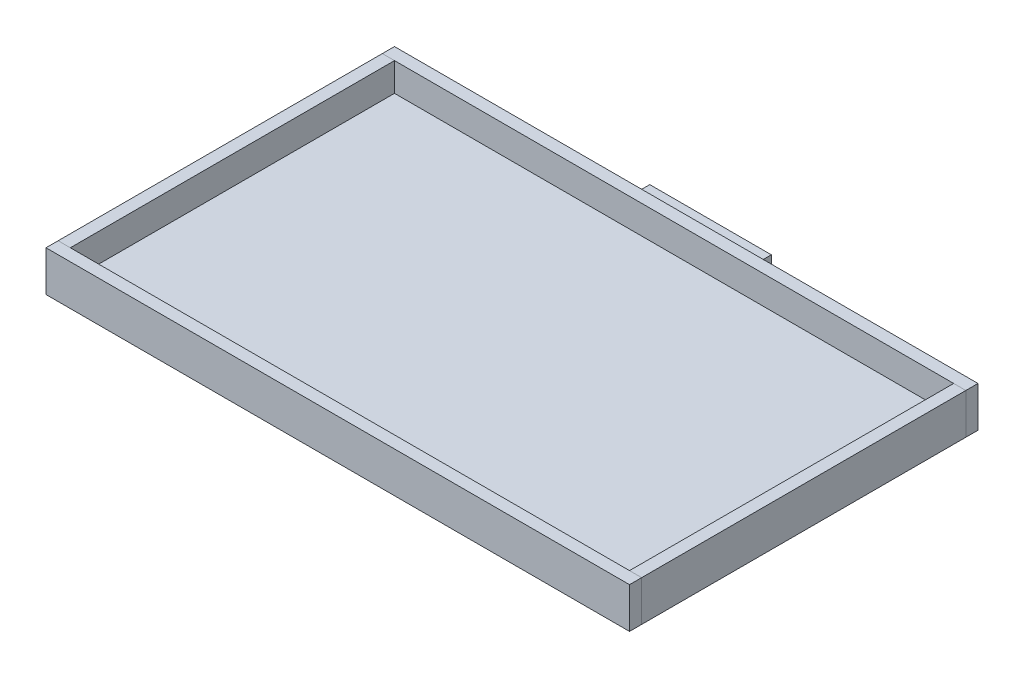
ISO-10303-21;
HEADER;
FILE_DESCRIPTION(('STEP AP214'),'2;1');
FILE_NAME('part.step','',(''),(''),'','','');
FILE_SCHEMA(('AUTOMOTIVE_DESIGN { 1 0 10303 214 1 1 1 1 }'));
ENDSEC;
DATA;
#1=APPLICATION_CONTEXT('core data for automotive mechanical design processes');
#2=APPLICATION_PROTOCOL_DEFINITION('international standard','automotive_design',2000,#1);
#3=PRODUCT_CONTEXT('',#1,'mechanical');
#4=PRODUCT('Part','Part','',(#3));
#5=PRODUCT_RELATED_PRODUCT_CATEGORY('part','',(#4));
#6=PRODUCT_DEFINITION_FORMATION('','',#4);
#7=PRODUCT_DEFINITION_CONTEXT('part definition',#1,'design');
#8=PRODUCT_DEFINITION('design','',#6,#7);
#9=PRODUCT_DEFINITION_SHAPE('','',#8);
#10=(LENGTH_UNIT() NAMED_UNIT(*) SI_UNIT(.MILLI.,.METRE.));
#11=(NAMED_UNIT(*) PLANE_ANGLE_UNIT() SI_UNIT($,.RADIAN.));
#12=(NAMED_UNIT(*) SI_UNIT($,.STERADIAN.) SOLID_ANGLE_UNIT());
#13=UNCERTAINTY_MEASURE_WITH_UNIT(LENGTH_MEASURE(1.E-05),#10,'distance_accuracy_value','');
#14=(GEOMETRIC_REPRESENTATION_CONTEXT(3) GLOBAL_UNCERTAINTY_ASSIGNED_CONTEXT((#13)) GLOBAL_UNIT_ASSIGNED_CONTEXT((#10,
#11,#12)) REPRESENTATION_CONTEXT('',''));
#15=CARTESIAN_POINT('',(0.,0.,0.));
#16=DIRECTION('',(0.,0.,1.));
#17=DIRECTION('',(1.,0.,0.));
#18=AXIS2_PLACEMENT_3D('',#15,#16,#17);
#19=CARTESIAN_POINT('',(895.35,0.,0.));
#20=DIRECTION('',(0.,0.,-1.));
#21=DIRECTION('',(-1.,0.,0.));
#22=AXIS2_PLACEMENT_3D('',#19,#20,#21);
#23=PLANE('',#22);
#24=DIRECTION('',(0.,-1.,0.));
#25=VECTOR('',#24,1.);
#26=CARTESIAN_POINT('',(876.3,0.,0.));
#27=LINE('',#26,#25);
#28=CARTESIAN_POINT('',(876.3,63.5,0.));
#29=VERTEX_POINT('',#28);
#30=CARTESIAN_POINT('',(876.3,0.,0.));
#31=VERTEX_POINT('',#30);
#32=EDGE_CURVE('E107',#29,#31,#27,.T.);
#33=ORIENTED_EDGE('',*,*,#32,.T.);
#34=DIRECTION('',(-1.,0.,0.));
#35=VECTOR('',#34,1.);
#36=CARTESIAN_POINT('',(895.35,0.,0.));
#37=LINE('',#36,#35);
#38=CARTESIAN_POINT('',(895.35,0.,0.));
#39=VERTEX_POINT('',#38);
#40=EDGE_CURVE('E12',#39,#31,#37,.T.);
#41=ORIENTED_EDGE('',*,*,#40,.F.);
#42=DIRECTION('',(0.,-1.,0.));
#43=VECTOR('',#42,1.);
#44=CARTESIAN_POINT('',(895.35,0.,0.));
#45=LINE('',#44,#43);
#46=CARTESIAN_POINT('',(895.35,63.5,0.));
#47=VERTEX_POINT('',#46);
#48=EDGE_CURVE('E95',#47,#39,#45,.T.);
#49=ORIENTED_EDGE('',*,*,#48,.F.);
#50=DIRECTION('',(-1.,0.,0.));
#51=VECTOR('',#50,1.);
#52=CARTESIAN_POINT('',(895.35,63.5,0.));
#53=LINE('',#52,#51);
#54=EDGE_CURVE('E103',#47,#29,#53,.T.);
#55=ORIENTED_EDGE('',*,*,#54,.T.);
#56=EDGE_LOOP('',(#33,#41,#49,#55));
#57=FACE_BOUND('',#56,.T.);
#58=ADVANCED_FACE('F44',(#57),#23,.F.);
#59=CARTESIAN_POINT('',(895.35,0.,0.));
#60=DIRECTION('',(0.,1.,0.));
#61=DIRECTION('',(0.,0.,1.));
#62=AXIS2_PLACEMENT_3D('',#59,#60,#61);
#63=PLANE('',#62);
#64=DIRECTION('',(0.,0.,-1.));
#65=VECTOR('',#64,1.);
#66=CARTESIAN_POINT('',(876.3,0.,0.));
#67=LINE('',#66,#65);
#68=CARTESIAN_POINT('',(876.3,0.,-508.));
#69=VERTEX_POINT('',#68);
#70=EDGE_CURVE('E99',#31,#69,#67,.T.);
#71=ORIENTED_EDGE('',*,*,#70,.T.);
#72=DIRECTION('',(-1.,0.,0.));
#73=VECTOR('',#72,1.);
#74=CARTESIAN_POINT('',(895.35,0.,-508.));
#75=LINE('',#74,#73);
#76=CARTESIAN_POINT('',(895.35,0.,-508.));
#77=VERTEX_POINT('',#76);
#78=EDGE_CURVE('E52',#77,#69,#75,.T.);
#79=ORIENTED_EDGE('',*,*,#78,.F.);
#80=DIRECTION('',(0.,0.,-1.));
#81=VECTOR('',#80,1.);
#82=CARTESIAN_POINT('',(895.35,0.,0.));
#83=LINE('',#82,#81);
#84=EDGE_CURVE('E90',#39,#77,#83,.T.);
#85=ORIENTED_EDGE('',*,*,#84,.F.);
#86=ORIENTED_EDGE('',*,*,#40,.T.);
#87=EDGE_LOOP('',(#71,#79,#85,#86));
#88=FACE_BOUND('',#87,.T.);
#89=ADVANCED_FACE('F98',(#88),#63,.F.);
#90=CARTESIAN_POINT('',(895.35,0.,-508.));
#91=DIRECTION('',(0.,0.,1.));
#92=DIRECTION('',(1.,0.,0.));
#93=AXIS2_PLACEMENT_3D('',#90,#91,#92);
#94=PLANE('',#93);
#95=DIRECTION('',(0.,1.,0.));
#96=VECTOR('',#95,1.);
#97=CARTESIAN_POINT('',(876.3,0.,-508.));
#98=LINE('',#97,#96);
#99=CARTESIAN_POINT('',(876.3,63.5,-508.));
#100=VERTEX_POINT('',#99);
#101=EDGE_CURVE('E77',#69,#100,#98,.T.);
#102=ORIENTED_EDGE('',*,*,#101,.T.);
#103=DIRECTION('',(-1.,0.,0.));
#104=VECTOR('',#103,1.);
#105=CARTESIAN_POINT('',(895.35,63.5,-508.));
#106=LINE('',#105,#104);
#107=CARTESIAN_POINT('',(895.35,63.5,-508.));
#108=VERTEX_POINT('',#107);
#109=EDGE_CURVE('E100',#108,#100,#106,.T.);
#110=ORIENTED_EDGE('',*,*,#109,.F.);
#111=DIRECTION('',(0.,1.,0.));
#112=VECTOR('',#111,1.);
#113=CARTESIAN_POINT('',(895.35,0.,-508.));
#114=LINE('',#113,#112);
#115=EDGE_CURVE('E93',#77,#108,#114,.T.);
#116=ORIENTED_EDGE('',*,*,#115,.F.);
#117=ORIENTED_EDGE('',*,*,#78,.T.);
#118=EDGE_LOOP('',(#102,#110,#116,#117));
#119=FACE_BOUND('',#118,.T.);
#120=ADVANCED_FACE('F101',(#119),#94,.F.);
#121=CARTESIAN_POINT('',(895.35,63.5,0.));
#122=DIRECTION('',(0.,-1.,0.));
#123=DIRECTION('',(0.,0.,-1.));
#124=AXIS2_PLACEMENT_3D('',#121,#122,#123);
#125=PLANE('',#124);
#126=DIRECTION('',(0.,0.,1.));
#127=VECTOR('',#126,1.);
#128=CARTESIAN_POINT('',(876.3,63.5,0.));
#129=LINE('',#128,#127);
#130=EDGE_CURVE('E83',#100,#29,#129,.T.);
#131=ORIENTED_EDGE('',*,*,#130,.T.);
#132=ORIENTED_EDGE('',*,*,#54,.F.);
#133=DIRECTION('',(0.,0.,1.));
#134=VECTOR('',#133,1.);
#135=CARTESIAN_POINT('',(895.35,63.5,0.));
#136=LINE('',#135,#134);
#137=EDGE_CURVE('E60',#108,#47,#136,.T.);
#138=ORIENTED_EDGE('',*,*,#137,.F.);
#139=ORIENTED_EDGE('',*,*,#109,.T.);
#140=EDGE_LOOP('',(#131,#132,#138,#139));
#141=FACE_BOUND('',#140,.T.);
#142=ADVANCED_FACE('F114',(#141),#125,.F.);
#143=CARTESIAN_POINT('',(895.35,0.,0.));
#144=DIRECTION('',(-1.,0.,0.));
#145=DIRECTION('',(0.,0.,1.));
#146=AXIS2_PLACEMENT_3D('',#143,#144,#145);
#147=PLANE('',#146);
#148=ORIENTED_EDGE('',*,*,#48,.T.);
#149=ORIENTED_EDGE('',*,*,#84,.T.);
#150=ORIENTED_EDGE('',*,*,#115,.T.);
#151=ORIENTED_EDGE('',*,*,#137,.T.);
#152=EDGE_LOOP('',(#148,#149,#150,#151));
#153=FACE_BOUND('',#152,.T.);
#154=ADVANCED_FACE('F91',(#153),#147,.F.);
#155=CARTESIAN_POINT('',(876.3,0.,0.));
#156=DIRECTION('',(-1.,0.,0.));
#157=DIRECTION('',(0.,0.,1.));
#158=AXIS2_PLACEMENT_3D('',#155,#156,#157);
#159=PLANE('',#158);
#160=ORIENTED_EDGE('',*,*,#32,.F.);
#161=ORIENTED_EDGE('',*,*,#130,.F.);
#162=ORIENTED_EDGE('',*,*,#101,.F.);
#163=ORIENTED_EDGE('',*,*,#70,.F.);
#164=EDGE_LOOP('',(#160,#161,#162,#163));
#165=FACE_BOUND('',#164,.T.);
#166=ADVANCED_FACE('F117',(#165),#159,.T.);
#167=CLOSED_SHELL('',(#58,#89,#120,#142,#154,#166));
#168=MANIFOLD_SOLID_BREP('B2',#167);
#169=CARTESIAN_POINT('',(-19.05,0.,-508.));
#170=DIRECTION('',(0.,0.,-1.));
#171=DIRECTION('',(-1.,0.,0.));
#172=AXIS2_PLACEMENT_3D('',#169,#170,#171);
#173=PLANE('',#172);
#174=DIRECTION('',(0.,1.,0.));
#175=VECTOR('',#174,1.);
#176=CARTESIAN_POINT('',(0.,0.,-508.));
#177=LINE('',#176,#175);
#178=CARTESIAN_POINT('',(0.,0.,-508.));
#179=VERTEX_POINT('',#178);
#180=CARTESIAN_POINT('',(0.,63.5000000000001,-508.));
#181=VERTEX_POINT('',#180);
#182=EDGE_CURVE('E242',#179,#181,#177,.T.);
#183=ORIENTED_EDGE('',*,*,#182,.F.);
#184=DIRECTION('',(1.,0.,0.));
#185=VECTOR('',#184,1.);
#186=CARTESIAN_POINT('',(-19.05,0.,-508.));
#187=LINE('',#186,#185);
#188=CARTESIAN_POINT('',(-19.05,0.,-508.));
#189=VERTEX_POINT('',#188);
#190=EDGE_CURVE('E42',#189,#179,#187,.T.);
#191=ORIENTED_EDGE('',*,*,#190,.F.);
#192=DIRECTION('',(0.,1.,0.));
#193=VECTOR('',#192,1.);
#194=CARTESIAN_POINT('',(-19.05,0.,-508.));
#195=LINE('',#194,#193);
#196=CARTESIAN_POINT('',(-19.05,63.5000000000001,-508.));
#197=VERTEX_POINT('',#196);
#198=EDGE_CURVE('E236',#189,#197,#195,.T.);
#199=ORIENTED_EDGE('',*,*,#198,.T.);
#200=DIRECTION('',(1.,0.,0.));
#201=VECTOR('',#200,1.);
#202=CARTESIAN_POINT('',(-19.05,63.5000000000001,-508.));
#203=LINE('',#202,#201);
#204=EDGE_CURVE('E181',#197,#181,#203,.T.);
#205=ORIENTED_EDGE('',*,*,#204,.T.);
#206=EDGE_LOOP('',(#183,#191,#199,#205));
#207=FACE_BOUND('',#206,.T.);
#208=ADVANCED_FACE('F178',(#207),#173,.T.);
#209=CARTESIAN_POINT('',(-19.05,0.,-508.));
#210=DIRECTION('',(0.,-1.,0.));
#211=DIRECTION('',(0.,0.,-1.));
#212=AXIS2_PLACEMENT_3D('',#209,#210,#211);
#213=PLANE('',#212);
#214=DIRECTION('',(0.,0.,-1.));
#215=VECTOR('',#214,1.);
#216=CARTESIAN_POINT('',(0.,0.,-508.));
#217=LINE('',#216,#215);
#218=CARTESIAN_POINT('',(0.,0.,0.));
#219=VERTEX_POINT('',#218);
#220=EDGE_CURVE('E238',#219,#179,#217,.T.);
#221=ORIENTED_EDGE('',*,*,#220,.F.);
#222=DIRECTION('',(1.,0.,0.));
#223=VECTOR('',#222,1.);
#224=CARTESIAN_POINT('',(-19.05,0.,0.));
#225=LINE('',#224,#223);
#226=CARTESIAN_POINT('',(-19.05,0.,0.));
#227=VERTEX_POINT('',#226);
#228=EDGE_CURVE('E187',#227,#219,#225,.T.);
#229=ORIENTED_EDGE('',*,*,#228,.F.);
#230=DIRECTION('',(0.,0.,-1.));
#231=VECTOR('',#230,1.);
#232=CARTESIAN_POINT('',(-19.05,0.,-508.));
#233=LINE('',#232,#231);
#234=EDGE_CURVE('E233',#227,#189,#233,.T.);
#235=ORIENTED_EDGE('',*,*,#234,.T.);
#236=ORIENTED_EDGE('',*,*,#190,.T.);
#237=EDGE_LOOP('',(#221,#229,#235,#236));
#238=FACE_BOUND('',#237,.T.);
#239=ADVANCED_FACE('F252',(#238),#213,.T.);
#240=CARTESIAN_POINT('',(-19.05,0.,0.));
#241=DIRECTION('',(0.,0.,1.));
#242=DIRECTION('',(1.,0.,0.));
#243=AXIS2_PLACEMENT_3D('',#240,#241,#242);
#244=PLANE('',#243);
#245=DIRECTION('',(0.,-1.,0.));
#246=VECTOR('',#245,1.);
#247=CARTESIAN_POINT('',(0.,0.,0.));
#248=LINE('',#247,#246);
#249=CARTESIAN_POINT('',(0.,63.5,0.));
#250=VERTEX_POINT('',#249);
#251=EDGE_CURVE('E228',#250,#219,#248,.T.);
#252=ORIENTED_EDGE('',*,*,#251,.F.);
#253=DIRECTION('',(1.,0.,0.));
#254=VECTOR('',#253,1.);
#255=CARTESIAN_POINT('',(-19.05,63.5,0.));
#256=LINE('',#255,#254);
#257=CARTESIAN_POINT('',(-19.05,63.5,0.));
#258=VERTEX_POINT('',#257);
#259=EDGE_CURVE('E223',#258,#250,#256,.T.);
#260=ORIENTED_EDGE('',*,*,#259,.F.);
#261=DIRECTION('',(0.,-1.,0.));
#262=VECTOR('',#261,1.);
#263=CARTESIAN_POINT('',(-19.05,0.,0.));
#264=LINE('',#263,#262);
#265=EDGE_CURVE('E226',#258,#227,#264,.T.);
#266=ORIENTED_EDGE('',*,*,#265,.T.);
#267=ORIENTED_EDGE('',*,*,#228,.T.);
#268=EDGE_LOOP('',(#252,#260,#266,#267));
#269=FACE_BOUND('',#268,.T.);
#270=ADVANCED_FACE('F225',(#269),#244,.T.);
#271=CARTESIAN_POINT('',(-19.05,63.5000000000001,-508.));
#272=DIRECTION('',(0.,1.,0.));
#273=DIRECTION('',(0.,0.,1.));
#274=AXIS2_PLACEMENT_3D('',#271,#272,#273);
#275=PLANE('',#274);
#276=DIRECTION('',(0.,0.,1.));
#277=VECTOR('',#276,1.);
#278=CARTESIAN_POINT('',(0.,63.5000000000001,-508.));
#279=LINE('',#278,#277);
#280=EDGE_CURVE('E245',#181,#250,#279,.T.);
#281=ORIENTED_EDGE('',*,*,#280,.F.);
#282=ORIENTED_EDGE('',*,*,#204,.F.);
#283=DIRECTION('',(0.,0.,1.));
#284=VECTOR('',#283,1.);
#285=CARTESIAN_POINT('',(-19.05,63.5000000000001,-508.));
#286=LINE('',#285,#284);
#287=EDGE_CURVE('E232',#197,#258,#286,.T.);
#288=ORIENTED_EDGE('',*,*,#287,.T.);
#289=ORIENTED_EDGE('',*,*,#259,.T.);
#290=EDGE_LOOP('',(#281,#282,#288,#289));
#291=FACE_BOUND('',#290,.T.);
#292=ADVANCED_FACE('F235',(#291),#275,.T.);
#293=CARTESIAN_POINT('',(-19.05,0.,0.));
#294=DIRECTION('',(1.,0.,0.));
#295=DIRECTION('',(0.,0.,-1.));
#296=AXIS2_PLACEMENT_3D('',#293,#294,#295);
#297=PLANE('',#296);
#298=ORIENTED_EDGE('',*,*,#198,.F.);
#299=ORIENTED_EDGE('',*,*,#234,.F.);
#300=ORIENTED_EDGE('',*,*,#265,.F.);
#301=ORIENTED_EDGE('',*,*,#287,.F.);
#302=EDGE_LOOP('',(#298,#299,#300,#301));
#303=FACE_BOUND('',#302,.T.);
#304=ADVANCED_FACE('F231',(#303),#297,.F.);
#305=CARTESIAN_POINT('',(0.,0.,0.));
#306=DIRECTION('',(1.,0.,0.));
#307=DIRECTION('',(0.,0.,-1.));
#308=AXIS2_PLACEMENT_3D('',#305,#306,#307);
#309=PLANE('',#308);
#310=ORIENTED_EDGE('',*,*,#182,.T.);
#311=ORIENTED_EDGE('',*,*,#280,.T.);
#312=ORIENTED_EDGE('',*,*,#251,.T.);
#313=ORIENTED_EDGE('',*,*,#220,.T.);
#314=EDGE_LOOP('',(#310,#311,#312,#313));
#315=FACE_BOUND('',#314,.T.);
#316=ADVANCED_FACE('F251',(#315),#309,.T.);
#317=CLOSED_SHELL('',(#208,#239,#270,#292,#304,#316));
#318=MANIFOLD_SOLID_BREP('B6',#317);
#319=CARTESIAN_POINT('',(0.,0.,-527.05));
#320=DIRECTION('',(0.,0.,1.));
#321=DIRECTION('',(1.,0.,0.));
#322=AXIS2_PLACEMENT_3D('',#319,#320,#321);
#323=PLANE('',#322);
#324=DIRECTION('',(0.,-1.,0.));
#325=VECTOR('',#324,1.);
#326=CARTESIAN_POINT('',(895.35,0.,-527.05));
#327=LINE('',#326,#325);
#328=CARTESIAN_POINT('',(895.35,63.5,-527.05));
#329=VERTEX_POINT('',#328);
#330=CARTESIAN_POINT('',(895.35,0.,-527.05));
#331=VERTEX_POINT('',#330);
#332=EDGE_CURVE('E407',#329,#331,#327,.T.);
#333=ORIENTED_EDGE('',*,*,#332,.T.);
#334=DIRECTION('',(-1.,0.,0.));
#335=VECTOR('',#334,1.);
#336=CARTESIAN_POINT('',(895.35,0.,-527.05));
#337=LINE('',#336,#335);
#338=CARTESIAN_POINT('',(-19.05,0.,-527.05));
#339=VERTEX_POINT('',#338);
#340=EDGE_CURVE('E410',#331,#339,#337,.T.);
#341=ORIENTED_EDGE('',*,*,#340,.T.);
#342=DIRECTION('',(0.,1.,0.));
#343=VECTOR('',#342,1.);
#344=CARTESIAN_POINT('',(-19.05,0.,-527.05));
#345=LINE('',#344,#343);
#346=CARTESIAN_POINT('',(-19.05,63.5,-527.05));
#347=VERTEX_POINT('',#346);
#348=EDGE_CURVE('E413',#339,#347,#345,.T.);
#349=ORIENTED_EDGE('',*,*,#348,.T.);
#350=DIRECTION('',(1.,0.,0.));
#351=VECTOR('',#350,1.);
#352=CARTESIAN_POINT('',(895.35,63.5,-527.05));
#353=LINE('',#352,#351);
#354=EDGE_CURVE('E415',#347,#329,#353,.T.);
#355=ORIENTED_EDGE('',*,*,#354,.T.);
#356=EDGE_LOOP('',(#333,#341,#349,#355));
#357=FACE_BOUND('',#356,.T.);
#358=DIRECTION('',(0.,-1.,0.));
#359=VECTOR('',#358,1.);
#360=CARTESIAN_POINT('',(533.4,38.1,-527.05));
#361=LINE('',#360,#359);
#362=CARTESIAN_POINT('',(533.4,38.1,-527.05));
#363=VERTEX_POINT('',#362);
#364=CARTESIAN_POINT('',(533.4,25.4,-527.05));
#365=VERTEX_POINT('',#364);
#366=EDGE_CURVE('E397',#363,#365,#361,.T.);
#367=ORIENTED_EDGE('',*,*,#366,.F.);
#368=DIRECTION('',(1.,0.,0.));
#369=VECTOR('',#368,1.);
#370=CARTESIAN_POINT('',(533.4,38.1,-527.05));
#371=LINE('',#370,#369);
#372=CARTESIAN_POINT('',(342.9,38.1,-527.05));
#373=VERTEX_POINT('',#372);
#374=EDGE_CURVE('E394',#373,#363,#371,.T.);
#375=ORIENTED_EDGE('',*,*,#374,.F.);
#376=DIRECTION('',(0.,1.,0.));
#377=VECTOR('',#376,1.);
#378=CARTESIAN_POINT('',(342.9,38.1,-527.05));
#379=LINE('',#378,#377);
#380=CARTESIAN_POINT('',(342.9,25.4,-527.05));
#381=VERTEX_POINT('',#380);
#382=EDGE_CURVE('E332',#381,#373,#379,.T.);
#383=ORIENTED_EDGE('',*,*,#382,.F.);
#384=DIRECTION('',(-1.,0.,0.));
#385=VECTOR('',#384,1.);
#386=CARTESIAN_POINT('',(533.4,25.4,-527.05));
#387=LINE('',#386,#385);
#388=EDGE_CURVE('E327',#365,#381,#387,.T.);
#389=ORIENTED_EDGE('',*,*,#388,.F.);
#390=EDGE_LOOP('',(#367,#375,#383,#389));
#391=FACE_BOUND('',#390,.T.);
#392=ADVANCED_FACE('F312',(#357,#391),#323,.F.);
#393=CARTESIAN_POINT('',(895.35,0.,-527.05));
#394=DIRECTION('',(-1.,0.,0.));
#395=DIRECTION('',(0.,-1.,0.));
#396=AXIS2_PLACEMENT_3D('',#393,#394,#395);
#397=PLANE('',#396);
#398=DIRECTION('',(0.,-1.,0.));
#399=VECTOR('',#398,1.);
#400=CARTESIAN_POINT('',(895.35,0.,-508.));
#401=LINE('',#400,#399);
#402=CARTESIAN_POINT('',(895.35,63.5,-508.));
#403=VERTEX_POINT('',#402);
#404=CARTESIAN_POINT('',(895.35,0.,-508.));
#405=VERTEX_POINT('',#404);
#406=EDGE_CURVE('E398',#403,#405,#401,.T.);
#407=ORIENTED_EDGE('',*,*,#406,.T.);
#408=DIRECTION('',(0.,0.,1.));
#409=VECTOR('',#408,1.);
#410=CARTESIAN_POINT('',(895.35,0.,-527.05));
#411=LINE('',#410,#409);
#412=EDGE_CURVE('E176',#331,#405,#411,.T.);
#413=ORIENTED_EDGE('',*,*,#412,.F.);
#414=ORIENTED_EDGE('',*,*,#332,.F.);
#415=DIRECTION('',(0.,0.,1.));
#416=VECTOR('',#415,1.);
#417=CARTESIAN_POINT('',(895.35,63.5,-527.05));
#418=LINE('',#417,#416);
#419=EDGE_CURVE('E416',#329,#403,#418,.T.);
#420=ORIENTED_EDGE('',*,*,#419,.T.);
#421=EDGE_LOOP('',(#407,#413,#414,#420));
#422=FACE_BOUND('',#421,.T.);
#423=ADVANCED_FACE('F314',(#422),#397,.F.);
#424=CARTESIAN_POINT('',(895.35,0.,-527.05));
#425=DIRECTION('',(0.,1.,0.));
#426=DIRECTION('',(0.,0.,1.));
#427=AXIS2_PLACEMENT_3D('',#424,#425,#426);
#428=PLANE('',#427);
#429=DIRECTION('',(-1.,0.,0.));
#430=VECTOR('',#429,1.);
#431=CARTESIAN_POINT('',(895.35,0.,-508.));
#432=LINE('',#431,#430);
#433=CARTESIAN_POINT('',(-19.05,0.,-508.));
#434=VERTEX_POINT('',#433);
#435=EDGE_CURVE('E401',#405,#434,#432,.T.);
#436=ORIENTED_EDGE('',*,*,#435,.T.);
#437=DIRECTION('',(0.,0.,1.));
#438=VECTOR('',#437,1.);
#439=CARTESIAN_POINT('',(-19.05,0.,-527.05));
#440=LINE('',#439,#438);
#441=EDGE_CURVE('E320',#339,#434,#440,.T.);
#442=ORIENTED_EDGE('',*,*,#441,.F.);
#443=ORIENTED_EDGE('',*,*,#340,.F.);
#444=ORIENTED_EDGE('',*,*,#412,.T.);
#445=EDGE_LOOP('',(#436,#442,#443,#444));
#446=FACE_BOUND('',#445,.T.);
#447=ADVANCED_FACE('F446',(#446),#428,.F.);
#448=CARTESIAN_POINT('',(-19.05,0.,-527.05));
#449=DIRECTION('',(1.,0.,0.));
#450=DIRECTION('',(0.,1.,0.));
#451=AXIS2_PLACEMENT_3D('',#448,#449,#450);
#452=PLANE('',#451);
#453=DIRECTION('',(0.,1.,0.));
#454=VECTOR('',#453,1.);
#455=CARTESIAN_POINT('',(-19.05,0.,-508.));
#456=LINE('',#455,#454);
#457=CARTESIAN_POINT('',(-19.05,63.5,-508.));
#458=VERTEX_POINT('',#457);
#459=EDGE_CURVE('E419',#434,#458,#456,.T.);
#460=ORIENTED_EDGE('',*,*,#459,.T.);
#461=DIRECTION('',(0.,0.,1.));
#462=VECTOR('',#461,1.);
#463=CARTESIAN_POINT('',(-19.05,63.5,-527.05));
#464=LINE('',#463,#462);
#465=EDGE_CURVE('E424',#347,#458,#464,.T.);
#466=ORIENTED_EDGE('',*,*,#465,.F.);
#467=ORIENTED_EDGE('',*,*,#348,.F.);
#468=ORIENTED_EDGE('',*,*,#441,.T.);
#469=EDGE_LOOP('',(#460,#466,#467,#468));
#470=FACE_BOUND('',#469,.T.);
#471=ADVANCED_FACE('F431',(#470),#452,.F.);
#472=CARTESIAN_POINT('',(895.35,63.5,-527.05));
#473=DIRECTION('',(0.,-1.,0.));
#474=DIRECTION('',(0.,0.,-1.));
#475=AXIS2_PLACEMENT_3D('',#472,#473,#474);
#476=PLANE('',#475);
#477=DIRECTION('',(1.,0.,0.));
#478=VECTOR('',#477,1.);
#479=CARTESIAN_POINT('',(895.35,63.5,-508.));
#480=LINE('',#479,#478);
#481=EDGE_CURVE('E411',#458,#403,#480,.T.);
#482=ORIENTED_EDGE('',*,*,#481,.T.);
#483=ORIENTED_EDGE('',*,*,#419,.F.);
#484=ORIENTED_EDGE('',*,*,#354,.F.);
#485=ORIENTED_EDGE('',*,*,#465,.T.);
#486=EDGE_LOOP('',(#482,#483,#484,#485));
#487=FACE_BOUND('',#486,.T.);
#488=ADVANCED_FACE('F440',(#487),#476,.F.);
#489=CARTESIAN_POINT('',(0.,0.,-508.));
#490=DIRECTION('',(0.,0.,1.));
#491=DIRECTION('',(1.,0.,0.));
#492=AXIS2_PLACEMENT_3D('',#489,#490,#491);
#493=PLANE('',#492);
#494=ORIENTED_EDGE('',*,*,#406,.F.);
#495=ORIENTED_EDGE('',*,*,#481,.F.);
#496=ORIENTED_EDGE('',*,*,#459,.F.);
#497=ORIENTED_EDGE('',*,*,#435,.F.);
#498=EDGE_LOOP('',(#494,#495,#496,#497));
#499=FACE_BOUND('',#498,.T.);
#500=ADVANCED_FACE('F437',(#499),#493,.T.);
#501=CARTESIAN_POINT('',(533.4,38.1,-565.15));
#502=DIRECTION('',(-1.,0.,0.));
#503=DIRECTION('',(0.,0.,1.));
#504=AXIS2_PLACEMENT_3D('',#501,#502,#503);
#505=PLANE('',#504);
#506=ORIENTED_EDGE('',*,*,#366,.T.);
#507=DIRECTION('',(0.,0.,1.));
#508=VECTOR('',#507,1.);
#509=CARTESIAN_POINT('',(533.4,25.4,-565.15));
#510=LINE('',#509,#508);
#511=CARTESIAN_POINT('',(533.4,25.4,-565.15));
#512=VERTEX_POINT('',#511);
#513=EDGE_CURVE('E378',#512,#365,#510,.T.);
#514=ORIENTED_EDGE('',*,*,#513,.F.);
#515=DIRECTION('',(0.,-1.,0.));
#516=VECTOR('',#515,1.);
#517=CARTESIAN_POINT('',(533.4,38.1,-565.15));
#518=LINE('',#517,#516);
#519=CARTESIAN_POINT('',(533.4,38.1,-565.15));
#520=VERTEX_POINT('',#519);
#521=EDGE_CURVE('E385',#520,#512,#518,.T.);
#522=ORIENTED_EDGE('',*,*,#521,.F.);
#523=DIRECTION('',(0.,0.,1.));
#524=VECTOR('',#523,1.);
#525=CARTESIAN_POINT('',(533.4,38.1,-565.15));
#526=LINE('',#525,#524);
#527=EDGE_CURVE('E539',#520,#363,#526,.T.);
#528=ORIENTED_EDGE('',*,*,#527,.T.);
#529=EDGE_LOOP('',(#506,#514,#522,#528));
#530=FACE_BOUND('',#529,.T.);
#531=ADVANCED_FACE('F396',(#530),#505,.F.);
#532=CARTESIAN_POINT('',(533.4,25.4,-565.15));
#533=DIRECTION('',(0.,1.,0.));
#534=DIRECTION('',(0.,0.,1.));
#535=AXIS2_PLACEMENT_3D('',#532,#533,#534);
#536=PLANE('',#535);
#537=ORIENTED_EDGE('',*,*,#388,.T.);
#538=DIRECTION('',(0.,0.,1.));
#539=VECTOR('',#538,1.);
#540=CARTESIAN_POINT('',(342.9,25.4,-565.15));
#541=LINE('',#540,#539);
#542=CARTESIAN_POINT('',(342.9,25.4,-565.15));
#543=VERTEX_POINT('',#542);
#544=EDGE_CURVE('E381',#543,#381,#541,.T.);
#545=ORIENTED_EDGE('',*,*,#544,.F.);
#546=DIRECTION('',(-1.,0.,0.));
#547=VECTOR('',#546,1.);
#548=CARTESIAN_POINT('',(533.4,25.4,-565.15));
#549=LINE('',#548,#547);
#550=EDGE_CURVE('E374',#512,#543,#549,.T.);
#551=ORIENTED_EDGE('',*,*,#550,.F.);
#552=ORIENTED_EDGE('',*,*,#513,.T.);
#553=EDGE_LOOP('',(#537,#545,#551,#552));
#554=FACE_BOUND('',#553,.T.);
#555=ADVANCED_FACE('F376',(#554),#536,.F.);
#556=CARTESIAN_POINT('',(342.9,38.1,-565.15));
#557=DIRECTION('',(1.,0.,0.));
#558=DIRECTION('',(0.,0.,-1.));
#559=AXIS2_PLACEMENT_3D('',#556,#557,#558);
#560=PLANE('',#559);
#561=ORIENTED_EDGE('',*,*,#382,.T.);
#562=DIRECTION('',(0.,0.,1.));
#563=VECTOR('',#562,1.);
#564=CARTESIAN_POINT('',(342.9,38.1,-565.15));
#565=LINE('',#564,#563);
#566=CARTESIAN_POINT('',(342.9,38.1,-565.15));
#567=VERTEX_POINT('',#566);
#568=EDGE_CURVE('E403',#567,#373,#565,.T.);
#569=ORIENTED_EDGE('',*,*,#568,.F.);
#570=DIRECTION('',(0.,1.,0.));
#571=VECTOR('',#570,1.);
#572=CARTESIAN_POINT('',(342.9,38.1,-565.15));
#573=LINE('',#572,#571);
#574=EDGE_CURVE('E384',#543,#567,#573,.T.);
#575=ORIENTED_EDGE('',*,*,#574,.F.);
#576=ORIENTED_EDGE('',*,*,#544,.T.);
#577=EDGE_LOOP('',(#561,#569,#575,#576));
#578=FACE_BOUND('',#577,.T.);
#579=ADVANCED_FACE('F482',(#578),#560,.F.);
#580=CARTESIAN_POINT('',(533.4,38.1,-565.15));
#581=DIRECTION('',(0.,-1.,0.));
#582=DIRECTION('',(0.,0.,-1.));
#583=AXIS2_PLACEMENT_3D('',#580,#581,#582);
#584=PLANE('',#583);
#585=ORIENTED_EDGE('',*,*,#374,.T.);
#586=ORIENTED_EDGE('',*,*,#527,.F.);
#587=DIRECTION('',(1.,0.,0.));
#588=VECTOR('',#587,1.);
#589=CARTESIAN_POINT('',(533.4,38.1,-565.15));
#590=LINE('',#589,#588);
#591=EDGE_CURVE('E390',#567,#520,#590,.T.);
#592=ORIENTED_EDGE('',*,*,#591,.F.);
#593=ORIENTED_EDGE('',*,*,#568,.T.);
#594=EDGE_LOOP('',(#585,#586,#592,#593));
#595=FACE_BOUND('',#594,.T.);
#596=ADVANCED_FACE('F488',(#595),#584,.F.);
#597=CARTESIAN_POINT('',(0.,0.,-565.15));
#598=DIRECTION('',(0.,0.,-1.));
#599=DIRECTION('',(-1.,0.,0.));
#600=AXIS2_PLACEMENT_3D('',#597,#598,#599);
#601=PLANE('',#600);
#602=ORIENTED_EDGE('',*,*,#521,.T.);
#603=ORIENTED_EDGE('',*,*,#550,.T.);
#604=ORIENTED_EDGE('',*,*,#574,.T.);
#605=ORIENTED_EDGE('',*,*,#591,.T.);
#606=EDGE_LOOP('',(#602,#603,#604,#605));
#607=FACE_BOUND('',#606,.T.);
#608=ADVANCED_FACE('F388',(#607),#601,.T.);
#609=CLOSED_SHELL('',(#392,#423,#447,#471,#488,#500,#531,#555,#579,#596,#608));
#610=MANIFOLD_SOLID_BREP('B36',#609);
#611=CARTESIAN_POINT('',(-19.05,0.,19.05));
#612=DIRECTION('',(1.,0.,0.));
#613=DIRECTION('',(0.,0.,-1.));
#614=AXIS2_PLACEMENT_3D('',#611,#612,#613);
#615=PLANE('',#614);
#616=DIRECTION('',(0.,-1.,0.));
#617=VECTOR('',#616,1.);
#618=CARTESIAN_POINT('',(-19.05,0.,0.));
#619=LINE('',#618,#617);
#620=CARTESIAN_POINT('',(-19.05,63.5,0.));
#621=VERTEX_POINT('',#620);
#622=CARTESIAN_POINT('',(-19.05,0.,0.));
#623=VERTEX_POINT('',#622);
#624=EDGE_CURVE('E623',#621,#623,#619,.T.);
#625=ORIENTED_EDGE('',*,*,#624,.T.);
#626=DIRECTION('',(0.,0.,-1.));
#627=VECTOR('',#626,1.);
#628=CARTESIAN_POINT('',(-19.05,0.,19.05));
#629=LINE('',#628,#627);
#630=CARTESIAN_POINT('',(-19.05,0.,19.05));
#631=VERTEX_POINT('',#630);
#632=EDGE_CURVE('E310',#631,#623,#629,.T.);
#633=ORIENTED_EDGE('',*,*,#632,.F.);
#634=DIRECTION('',(0.,-1.,0.));
#635=VECTOR('',#634,1.);
#636=CARTESIAN_POINT('',(-19.05,0.,19.05));
#637=LINE('',#636,#635);
#638=CARTESIAN_POINT('',(-19.05,63.5,19.05));
#639=VERTEX_POINT('',#638);
#640=EDGE_CURVE('E611',#639,#631,#637,.T.);
#641=ORIENTED_EDGE('',*,*,#640,.F.);
#642=DIRECTION('',(0.,0.,-1.));
#643=VECTOR('',#642,1.);
#644=CARTESIAN_POINT('',(-19.05,63.5,19.05));
#645=LINE('',#644,#643);
#646=EDGE_CURVE('E619',#639,#621,#645,.T.);
#647=ORIENTED_EDGE('',*,*,#646,.T.);
#648=EDGE_LOOP('',(#625,#633,#641,#647));
#649=FACE_BOUND('',#648,.T.);
#650=ADVANCED_FACE('F560',(#649),#615,.F.);
#651=CARTESIAN_POINT('',(-19.05,0.,19.05));
#652=DIRECTION('',(0.,1.,0.));
#653=DIRECTION('',(0.,0.,1.));
#654=AXIS2_PLACEMENT_3D('',#651,#652,#653);
#655=PLANE('',#654);
#656=DIRECTION('',(1.,0.,0.));
#657=VECTOR('',#656,1.);
#658=CARTESIAN_POINT('',(-19.05,0.,0.));
#659=LINE('',#658,#657);
#660=CARTESIAN_POINT('',(895.35,0.,0.));
#661=VERTEX_POINT('',#660);
#662=EDGE_CURVE('E615',#623,#661,#659,.T.);
#663=ORIENTED_EDGE('',*,*,#662,.T.);
#664=DIRECTION('',(0.,0.,-1.));
#665=VECTOR('',#664,1.);
#666=CARTESIAN_POINT('',(895.35,0.,19.05));
#667=LINE('',#666,#665);
#668=CARTESIAN_POINT('',(895.35,0.,19.05));
#669=VERTEX_POINT('',#668);
#670=EDGE_CURVE('E568',#669,#661,#667,.T.);
#671=ORIENTED_EDGE('',*,*,#670,.F.);
#672=DIRECTION('',(1.,0.,0.));
#673=VECTOR('',#672,1.);
#674=CARTESIAN_POINT('',(-19.05,0.,19.05));
#675=LINE('',#674,#673);
#676=EDGE_CURVE('E606',#631,#669,#675,.T.);
#677=ORIENTED_EDGE('',*,*,#676,.F.);
#678=ORIENTED_EDGE('',*,*,#632,.T.);
#679=EDGE_LOOP('',(#663,#671,#677,#678));
#680=FACE_BOUND('',#679,.T.);
#681=ADVANCED_FACE('F614',(#680),#655,.F.);
#682=CARTESIAN_POINT('',(895.35,0.,19.05));
#683=DIRECTION('',(-1.,0.,0.));
#684=DIRECTION('',(0.,-1.,0.));
#685=AXIS2_PLACEMENT_3D('',#682,#683,#684);
#686=PLANE('',#685);
#687=DIRECTION('',(0.,1.,0.));
#688=VECTOR('',#687,1.);
#689=CARTESIAN_POINT('',(895.35,0.,0.));
#690=LINE('',#689,#688);
#691=CARTESIAN_POINT('',(895.35,63.5,0.));
#692=VERTEX_POINT('',#691);
#693=EDGE_CURVE('E593',#661,#692,#690,.T.);
#694=ORIENTED_EDGE('',*,*,#693,.T.);
#695=DIRECTION('',(0.,0.,-1.));
#696=VECTOR('',#695,1.);
#697=CARTESIAN_POINT('',(895.35,63.5,19.05));
#698=LINE('',#697,#696);
#699=CARTESIAN_POINT('',(895.35,63.5,19.05));
#700=VERTEX_POINT('',#699);
#701=EDGE_CURVE('E616',#700,#692,#698,.T.);
#702=ORIENTED_EDGE('',*,*,#701,.F.);
#703=DIRECTION('',(0.,1.,0.));
#704=VECTOR('',#703,1.);
#705=CARTESIAN_POINT('',(895.35,0.,19.05));
#706=LINE('',#705,#704);
#707=EDGE_CURVE('E609',#669,#700,#706,.T.);
#708=ORIENTED_EDGE('',*,*,#707,.F.);
#709=ORIENTED_EDGE('',*,*,#670,.T.);
#710=EDGE_LOOP('',(#694,#702,#708,#709));
#711=FACE_BOUND('',#710,.T.);
#712=ADVANCED_FACE('F617',(#711),#686,.F.);
#713=CARTESIAN_POINT('',(-19.05,63.5,19.05));
#714=DIRECTION('',(0.,-1.,0.));
#715=DIRECTION('',(0.,0.,-1.));
#716=AXIS2_PLACEMENT_3D('',#713,#714,#715);
#717=PLANE('',#716);
#718=DIRECTION('',(-1.,0.,0.));
#719=VECTOR('',#718,1.);
#720=CARTESIAN_POINT('',(-19.05,63.5,0.));
#721=LINE('',#720,#719);
#722=EDGE_CURVE('E599',#692,#621,#721,.T.);
#723=ORIENTED_EDGE('',*,*,#722,.T.);
#724=ORIENTED_EDGE('',*,*,#646,.F.);
#725=DIRECTION('',(-1.,0.,0.));
#726=VECTOR('',#725,1.);
#727=CARTESIAN_POINT('',(-19.05,63.5,19.05));
#728=LINE('',#727,#726);
#729=EDGE_CURVE('E576',#700,#639,#728,.T.);
#730=ORIENTED_EDGE('',*,*,#729,.F.);
#731=ORIENTED_EDGE('',*,*,#701,.T.);
#732=EDGE_LOOP('',(#723,#724,#730,#731));
#733=FACE_BOUND('',#732,.T.);
#734=ADVANCED_FACE('F630',(#733),#717,.F.);
#735=CARTESIAN_POINT('',(0.,0.,19.05));
#736=DIRECTION('',(0.,0.,-1.));
#737=DIRECTION('',(-1.,0.,0.));
#738=AXIS2_PLACEMENT_3D('',#735,#736,#737);
#739=PLANE('',#738);
#740=ORIENTED_EDGE('',*,*,#640,.T.);
#741=ORIENTED_EDGE('',*,*,#676,.T.);
#742=ORIENTED_EDGE('',*,*,#707,.T.);
#743=ORIENTED_EDGE('',*,*,#729,.T.);
#744=EDGE_LOOP('',(#740,#741,#742,#743));
#745=FACE_BOUND('',#744,.T.);
#746=ADVANCED_FACE('F607',(#745),#739,.F.);
#747=CARTESIAN_POINT('',(0.,0.,0.));
#748=DIRECTION('',(0.,0.,-1.));
#749=DIRECTION('',(-1.,0.,0.));
#750=AXIS2_PLACEMENT_3D('',#747,#748,#749);
#751=PLANE('',#750);
#752=ORIENTED_EDGE('',*,*,#624,.F.);
#753=ORIENTED_EDGE('',*,*,#722,.F.);
#754=ORIENTED_EDGE('',*,*,#693,.F.);
#755=ORIENTED_EDGE('',*,*,#662,.F.);
#756=EDGE_LOOP('',(#752,#753,#754,#755));
#757=FACE_BOUND('',#756,.T.);
#758=ADVANCED_FACE('F633',(#757),#751,.T.);
#759=CLOSED_SHELL('',(#650,#681,#712,#734,#746,#758));
#760=MANIFOLD_SOLID_BREP('B170',#759);
#761=CARTESIAN_POINT('',(0.,19.05,0.));
#762=DIRECTION('',(1.,0.,0.));
#763=DIRECTION('',(0.,0.,-1.));
#764=AXIS2_PLACEMENT_3D('',#761,#762,#763);
#765=PLANE('',#764);
#766=DIRECTION('',(0.,0.,1.));
#767=VECTOR('',#766,1.);
#768=CARTESIAN_POINT('',(0.,0.,0.));
#769=LINE('',#768,#767);
#770=CARTESIAN_POINT('',(0.,0.,-508.));
#771=VERTEX_POINT('',#770);
#772=CARTESIAN_POINT('',(0.,0.,0.));
#773=VERTEX_POINT('',#772);
#774=EDGE_CURVE('E747',#771,#773,#769,.T.);
#775=ORIENTED_EDGE('',*,*,#774,.T.);
#776=DIRECTION('',(0.,-1.,0.));
#777=VECTOR('',#776,1.);
#778=CARTESIAN_POINT('',(0.,19.05,0.));
#779=LINE('',#778,#777);
#780=CARTESIAN_POINT('',(0.,19.05,0.));
#781=VERTEX_POINT('',#780);
#782=EDGE_CURVE('E558',#781,#773,#779,.T.);
#783=ORIENTED_EDGE('',*,*,#782,.F.);
#784=DIRECTION('',(0.,0.,1.));
#785=VECTOR('',#784,1.);
#786=CARTESIAN_POINT('',(0.,19.05,0.));
#787=LINE('',#786,#785);
#788=CARTESIAN_POINT('',(0.,19.05,-508.));
#789=VERTEX_POINT('',#788);
#790=EDGE_CURVE('E735',#789,#781,#787,.T.);
#791=ORIENTED_EDGE('',*,*,#790,.F.);
#792=DIRECTION('',(0.,-1.,0.));
#793=VECTOR('',#792,1.);
#794=CARTESIAN_POINT('',(0.,19.05,-508.));
#795=LINE('',#794,#793);
#796=EDGE_CURVE('E743',#789,#771,#795,.T.);
#797=ORIENTED_EDGE('',*,*,#796,.T.);
#798=EDGE_LOOP('',(#775,#783,#791,#797));
#799=FACE_BOUND('',#798,.T.);
#800=ADVANCED_FACE('F684',(#799),#765,.F.);
#801=CARTESIAN_POINT('',(0.,19.05,0.));
#802=DIRECTION('',(0.,0.,-1.));
#803=DIRECTION('',(-1.,0.,0.));
#804=AXIS2_PLACEMENT_3D('',#801,#802,#803);
#805=PLANE('',#804);
#806=DIRECTION('',(1.,0.,0.));
#807=VECTOR('',#806,1.);
#808=CARTESIAN_POINT('',(0.,0.,0.));
#809=LINE('',#808,#807);
#810=CARTESIAN_POINT('',(876.3,0.,0.));
#811=VERTEX_POINT('',#810);
#812=EDGE_CURVE('E739',#773,#811,#809,.T.);
#813=ORIENTED_EDGE('',*,*,#812,.T.);
#814=DIRECTION('',(0.,-1.,0.));
#815=VECTOR('',#814,1.);
#816=CARTESIAN_POINT('',(876.3,19.05,0.));
#817=LINE('',#816,#815);
#818=CARTESIAN_POINT('',(876.3,19.05,0.));
#819=VERTEX_POINT('',#818);
#820=EDGE_CURVE('E692',#819,#811,#817,.T.);
#821=ORIENTED_EDGE('',*,*,#820,.F.);
#822=DIRECTION('',(1.,0.,0.));
#823=VECTOR('',#822,1.);
#824=CARTESIAN_POINT('',(0.,19.05,0.));
#825=LINE('',#824,#823);
#826=EDGE_CURVE('E730',#781,#819,#825,.T.);
#827=ORIENTED_EDGE('',*,*,#826,.F.);
#828=ORIENTED_EDGE('',*,*,#782,.T.);
#829=EDGE_LOOP('',(#813,#821,#827,#828));
#830=FACE_BOUND('',#829,.T.);
#831=ADVANCED_FACE('F738',(#830),#805,.F.);
#832=CARTESIAN_POINT('',(876.3,19.05,0.));
#833=DIRECTION('',(-1.,0.,0.));
#834=DIRECTION('',(0.,0.,1.));
#835=AXIS2_PLACEMENT_3D('',#832,#833,#834);
#836=PLANE('',#835);
#837=DIRECTION('',(0.,0.,-1.));
#838=VECTOR('',#837,1.);
#839=CARTESIAN_POINT('',(876.3,0.,0.));
#840=LINE('',#839,#838);
#841=CARTESIAN_POINT('',(876.3,0.,-508.));
#842=VERTEX_POINT('',#841);
#843=EDGE_CURVE('E717',#811,#842,#840,.T.);
#844=ORIENTED_EDGE('',*,*,#843,.T.);
#845=DIRECTION('',(0.,-1.,0.));
#846=VECTOR('',#845,1.);
#847=CARTESIAN_POINT('',(876.3,19.05,-508.));
#848=LINE('',#847,#846);
#849=CARTESIAN_POINT('',(876.3,19.05,-508.));
#850=VERTEX_POINT('',#849);
#851=EDGE_CURVE('E740',#850,#842,#848,.T.);
#852=ORIENTED_EDGE('',*,*,#851,.F.);
#853=DIRECTION('',(0.,0.,-1.));
#854=VECTOR('',#853,1.);
#855=CARTESIAN_POINT('',(876.3,19.05,0.));
#856=LINE('',#855,#854);
#857=EDGE_CURVE('E733',#819,#850,#856,.T.);
#858=ORIENTED_EDGE('',*,*,#857,.F.);
#859=ORIENTED_EDGE('',*,*,#820,.T.);
#860=EDGE_LOOP('',(#844,#852,#858,#859));
#861=FACE_BOUND('',#860,.T.);
#862=ADVANCED_FACE('F741',(#861),#836,.F.);
#863=CARTESIAN_POINT('',(0.,19.05,-508.));
#864=DIRECTION('',(0.,0.,1.));
#865=DIRECTION('',(1.,0.,0.));
#866=AXIS2_PLACEMENT_3D('',#863,#864,#865);
#867=PLANE('',#866);
#868=DIRECTION('',(-1.,0.,0.));
#869=VECTOR('',#868,1.);
#870=CARTESIAN_POINT('',(0.,0.,-508.));
#871=LINE('',#870,#869);
#872=EDGE_CURVE('E723',#842,#771,#871,.T.);
#873=ORIENTED_EDGE('',*,*,#872,.T.);
#874=ORIENTED_EDGE('',*,*,#796,.F.);
#875=DIRECTION('',(-1.,0.,0.));
#876=VECTOR('',#875,1.);
#877=CARTESIAN_POINT('',(0.,19.05,-508.));
#878=LINE('',#877,#876);
#879=EDGE_CURVE('E700',#850,#789,#878,.T.);
#880=ORIENTED_EDGE('',*,*,#879,.F.);
#881=ORIENTED_EDGE('',*,*,#851,.T.);
#882=EDGE_LOOP('',(#873,#874,#880,#881));
#883=FACE_BOUND('',#882,.T.);
#884=ADVANCED_FACE('F754',(#883),#867,.F.);
#885=CARTESIAN_POINT('',(0.,19.05,0.));
#886=DIRECTION('',(0.,-1.,0.));
#887=DIRECTION('',(0.,0.,-1.));
#888=AXIS2_PLACEMENT_3D('',#885,#886,#887);
#889=PLANE('',#888);
#890=ORIENTED_EDGE('',*,*,#790,.T.);
#891=ORIENTED_EDGE('',*,*,#826,.T.);
#892=ORIENTED_EDGE('',*,*,#857,.T.);
#893=ORIENTED_EDGE('',*,*,#879,.T.);
#894=EDGE_LOOP('',(#890,#891,#892,#893));
#895=FACE_BOUND('',#894,.T.);
#896=ADVANCED_FACE('F731',(#895),#889,.F.);
#897=CARTESIAN_POINT('',(0.,0.,0.));
#898=DIRECTION('',(0.,-1.,0.));
#899=DIRECTION('',(0.,0.,-1.));
#900=AXIS2_PLACEMENT_3D('',#897,#898,#899);
#901=PLANE('',#900);
#902=ORIENTED_EDGE('',*,*,#774,.F.);
#903=ORIENTED_EDGE('',*,*,#872,.F.);
#904=ORIENTED_EDGE('',*,*,#843,.F.);
#905=ORIENTED_EDGE('',*,*,#812,.F.);
#906=EDGE_LOOP('',(#902,#903,#904,#905));
#907=FACE_BOUND('',#906,.T.);
#908=ADVANCED_FACE('F757',(#907),#901,.T.);
#909=CLOSED_SHELL('',(#800,#831,#862,#884,#896,#908));
#910=MANIFOLD_SOLID_BREP('B304',#909);
#911=ADVANCED_BREP_SHAPE_REPRESENTATION('',(#18,#168,#318,#610,#760,#910),#14);
#912=SHAPE_DEFINITION_REPRESENTATION(#9,#911);
ENDSEC;
END-ISO-10303-21;
